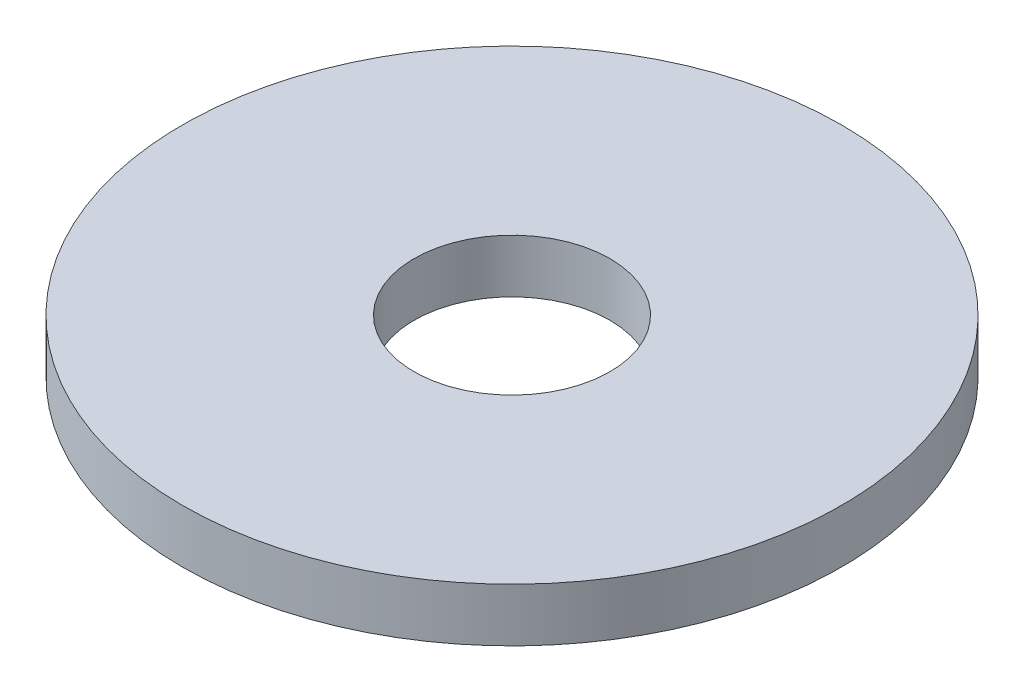
ISO-10303-21;
HEADER;
FILE_DESCRIPTION(('STEP AP214'),'2;1');
FILE_NAME('part.step','',(''),(''),'','','');
FILE_SCHEMA(('AUTOMOTIVE_DESIGN { 1 0 10303 214 1 1 1 1 }'));
ENDSEC;
DATA;
#1=APPLICATION_CONTEXT('core data for automotive mechanical design processes');
#2=APPLICATION_PROTOCOL_DEFINITION('international standard','automotive_design',2000,#1);
#3=PRODUCT_CONTEXT('',#1,'mechanical');
#4=PRODUCT('Part','Part','',(#3));
#5=PRODUCT_RELATED_PRODUCT_CATEGORY('part','',(#4));
#6=PRODUCT_DEFINITION_FORMATION('','',#4);
#7=PRODUCT_DEFINITION_CONTEXT('part definition',#1,'design');
#8=PRODUCT_DEFINITION('design','',#6,#7);
#9=PRODUCT_DEFINITION_SHAPE('','',#8);
#10=(LENGTH_UNIT() NAMED_UNIT(*) SI_UNIT(.MILLI.,.METRE.));
#11=(NAMED_UNIT(*) PLANE_ANGLE_UNIT() SI_UNIT($,.RADIAN.));
#12=(NAMED_UNIT(*) SI_UNIT($,.STERADIAN.) SOLID_ANGLE_UNIT());
#13=UNCERTAINTY_MEASURE_WITH_UNIT(LENGTH_MEASURE(1.E-05),#10,'distance_accuracy_value','');
#14=(GEOMETRIC_REPRESENTATION_CONTEXT(3) GLOBAL_UNCERTAINTY_ASSIGNED_CONTEXT((#13)) GLOBAL_UNIT_ASSIGNED_CONTEXT((#10,
#11,#12)) REPRESENTATION_CONTEXT('',''));
#15=CARTESIAN_POINT('',(0.,0.,0.));
#16=DIRECTION('',(0.,0.,1.));
#17=DIRECTION('',(1.,0.,0.));
#18=AXIS2_PLACEMENT_3D('',#15,#16,#17);
#19=CARTESIAN_POINT('',(18.5,3.,0.));
#20=DIRECTION('',(0.,1.,0.));
#21=DIRECTION('',(0.,0.,1.));
#22=AXIS2_PLACEMENT_3D('',#19,#20,#21);
#23=PLANE('',#22);
#24=CARTESIAN_POINT('',(0.,3.,0.));
#25=DIRECTION('',(0.,-1.,0.));
#26=DIRECTION('',(0.,0.,-1.));
#27=AXIS2_PLACEMENT_3D('',#24,#25,#26);
#28=CIRCLE('',#27,5.5);
#29=CARTESIAN_POINT('',(0.,3.,-5.5));
#30=VERTEX_POINT('',#29);
#31=EDGE_CURVE('E10',#30,#30,#28,.T.);
#32=ORIENTED_EDGE('',*,*,#31,.T.);
#33=EDGE_LOOP('',(#32));
#34=FACE_BOUND('',#33,.T.);
#35=CARTESIAN_POINT('',(0.,3.,0.));
#36=DIRECTION('',(0.,-1.,0.));
#37=DIRECTION('',(0.,0.,-1.));
#38=AXIS2_PLACEMENT_3D('',#35,#36,#37);
#39=CIRCLE('',#38,18.5);
#40=CARTESIAN_POINT('',(0.,3.,-18.5));
#41=VERTEX_POINT('',#40);
#42=EDGE_CURVE('E52',#41,#41,#39,.T.);
#43=ORIENTED_EDGE('',*,*,#42,.F.);
#44=EDGE_LOOP('',(#43));
#45=FACE_BOUND('',#44,.T.);
#46=ADVANCED_FACE('F38',(#34,#45),#23,.T.);
#47=CARTESIAN_POINT('',(0.,0.,0.));
#48=DIRECTION('',(0.,-1.,0.));
#49=DIRECTION('',(0.,0.,-1.));
#50=AXIS2_PLACEMENT_3D('',#47,#48,#49);
#51=CYLINDRICAL_SURFACE('',#50,5.5);
#52=CARTESIAN_POINT('',(0.,0.,0.));
#53=DIRECTION('',(0.,-1.,0.));
#54=DIRECTION('',(0.,0.,-1.));
#55=AXIS2_PLACEMENT_3D('',#52,#53,#54);
#56=CIRCLE('',#55,5.5);
#57=CARTESIAN_POINT('',(0.,0.,-5.5));
#58=VERTEX_POINT('',#57);
#59=EDGE_CURVE('E44',#58,#58,#56,.T.);
#60=ORIENTED_EDGE('',*,*,#59,.T.);
#61=EDGE_LOOP('',(#60));
#62=FACE_BOUND('',#61,.T.);
#63=ORIENTED_EDGE('',*,*,#31,.F.);
#64=EDGE_LOOP('',(#63));
#65=FACE_BOUND('',#64,.T.);
#66=ADVANCED_FACE('F62',(#62,#65),#51,.F.);
#67=CARTESIAN_POINT('',(5.5,0.,0.));
#68=DIRECTION('',(0.,-1.,0.));
#69=DIRECTION('',(0.,0.,-1.));
#70=AXIS2_PLACEMENT_3D('',#67,#68,#69);
#71=PLANE('',#70);
#72=CARTESIAN_POINT('',(0.,0.,0.));
#73=DIRECTION('',(0.,-1.,0.));
#74=DIRECTION('',(0.,0.,-1.));
#75=AXIS2_PLACEMENT_3D('',#72,#73,#74);
#76=CIRCLE('',#75,18.5);
#77=CARTESIAN_POINT('',(0.,0.,-18.5));
#78=VERTEX_POINT('',#77);
#79=EDGE_CURVE('E48',#78,#78,#76,.T.);
#80=ORIENTED_EDGE('',*,*,#79,.T.);
#81=EDGE_LOOP('',(#80));
#82=FACE_BOUND('',#81,.T.);
#83=ORIENTED_EDGE('',*,*,#59,.F.);
#84=EDGE_LOOP('',(#83));
#85=FACE_BOUND('',#84,.T.);
#86=ADVANCED_FACE('F66',(#82,#85),#71,.T.);
#87=CARTESIAN_POINT('',(0.,0.,0.));
#88=DIRECTION('',(0.,-1.,0.));
#89=DIRECTION('',(0.,0.,-1.));
#90=AXIS2_PLACEMENT_3D('',#87,#88,#89);
#91=CYLINDRICAL_SURFACE('',#90,18.5);
#92=ORIENTED_EDGE('',*,*,#42,.T.);
#93=EDGE_LOOP('',(#92));
#94=FACE_BOUND('',#93,.T.);
#95=ORIENTED_EDGE('',*,*,#79,.F.);
#96=EDGE_LOOP('',(#95));
#97=FACE_BOUND('',#96,.T.);
#98=ADVANCED_FACE('F58',(#94,#97),#91,.T.);
#99=CLOSED_SHELL('',(#46,#66,#86,#98));
#100=MANIFOLD_SOLID_BREP('B2',#99);
#101=ADVANCED_BREP_SHAPE_REPRESENTATION('',(#18,#100),#14);
#102=SHAPE_DEFINITION_REPRESENTATION(#9,#101);
ENDSEC;
END-ISO-10303-21;
